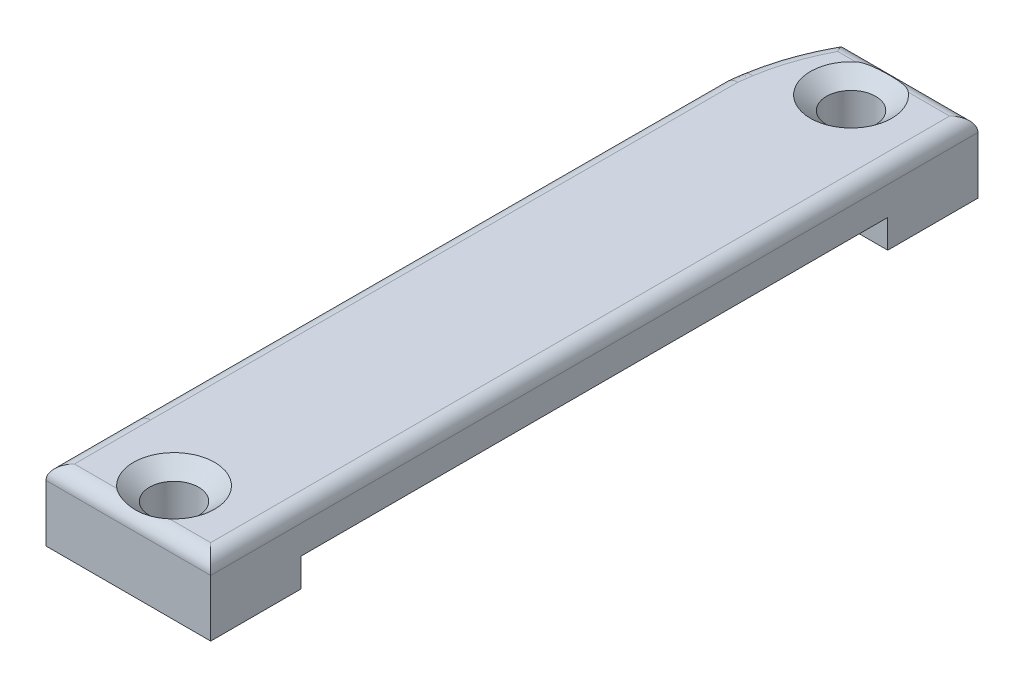
ISO-10303-21;
HEADER;
FILE_DESCRIPTION(('STEP AP214'),'2;1');
FILE_NAME('part.step','',(''),(''),'','','');
FILE_SCHEMA(('AUTOMOTIVE_DESIGN { 1 0 10303 214 1 1 1 1 }'));
ENDSEC;
DATA;
#1=APPLICATION_CONTEXT('core data for automotive mechanical design processes');
#2=APPLICATION_PROTOCOL_DEFINITION('international standard','automotive_design',2000,#1);
#3=PRODUCT_CONTEXT('',#1,'mechanical');
#4=PRODUCT('Part','Part','',(#3));
#5=PRODUCT_RELATED_PRODUCT_CATEGORY('part','',(#4));
#6=PRODUCT_DEFINITION_FORMATION('','',#4);
#7=PRODUCT_DEFINITION_CONTEXT('part definition',#1,'design');
#8=PRODUCT_DEFINITION('design','',#6,#7);
#9=PRODUCT_DEFINITION_SHAPE('','',#8);
#10=(LENGTH_UNIT() NAMED_UNIT(*) SI_UNIT(.MILLI.,.METRE.));
#11=(NAMED_UNIT(*) PLANE_ANGLE_UNIT() SI_UNIT($,.RADIAN.));
#12=(NAMED_UNIT(*) SI_UNIT($,.STERADIAN.) SOLID_ANGLE_UNIT());
#13=UNCERTAINTY_MEASURE_WITH_UNIT(LENGTH_MEASURE(1.E-05),#10,'distance_accuracy_value','');
#14=(GEOMETRIC_REPRESENTATION_CONTEXT(3) GLOBAL_UNCERTAINTY_ASSIGNED_CONTEXT((#13)) GLOBAL_UNIT_ASSIGNED_CONTEXT((#10,
#11,#12)) REPRESENTATION_CONTEXT('',''));
#15=CARTESIAN_POINT('',(0.,0.,0.));
#16=DIRECTION('',(0.,0.,1.));
#17=DIRECTION('',(1.,0.,0.));
#18=AXIS2_PLACEMENT_3D('',#15,#16,#17);
#19=CARTESIAN_POINT('',(-16.6687499998692,27.2895725541895,-228.6));
#20=DIRECTION('',(0.,1.,0.));
#21=DIRECTION('',(0.,0.,1.));
#22=AXIS2_PLACEMENT_3D('',#19,#20,#21);
#23=PLANE('',#22);
#24=DIRECTION('',(1.,0.,0.));
#25=VECTOR('',#24,1.);
#26=CARTESIAN_POINT('',(0.,27.2895725541895,-188.912499999872));
#27=LINE('',#26,#25);
#28=CARTESIAN_POINT('',(-32.5411605445574,27.2895725541895,-188.912499999872));
#29=VERTEX_POINT('',#28);
#30=CARTESIAN_POINT('',(-20.955,27.2895725541895,-188.912499999872));
#31=VERTEX_POINT('',#30);
#32=EDGE_CURVE('E563',#29,#31,#27,.T.);
#33=ORIENTED_EDGE('',*,*,#32,.F.);
#34=DIRECTION('',(0.00189043078895237,0.,-0.99999821313412));
#35=VECTOR('',#34,1.);
#36=CARTESIAN_POINT('',(-32.5411605445571,27.2895725541895,-188.9125));
#37=LINE('',#36,#35);
#38=CARTESIAN_POINT('',(-32.4631755639373,27.2895725541895,-230.187499999999));
#39=VERTEX_POINT('',#38);
#40=EDGE_CURVE('E280',#39,#29,#37,.F.);
#41=ORIENTED_EDGE('',*,*,#40,.F.);
#42=DIRECTION('',(1.,0.,0.));
#43=VECTOR('',#42,1.);
#44=CARTESIAN_POINT('',(0.,27.2895725541895,-230.187499999999));
#45=LINE('',#44,#43);
#46=CARTESIAN_POINT('',(-20.955,27.2895725541895,-230.187499999999));
#47=VERTEX_POINT('',#46);
#48=EDGE_CURVE('E552',#39,#47,#45,.T.);
#49=ORIENTED_EDGE('',*,*,#48,.T.);
#50=DIRECTION('',(0.,0.,-1.));
#51=VECTOR('',#50,1.);
#52=CARTESIAN_POINT('',(-20.955,27.2895725541895,0.));
#53=LINE('',#52,#51);
#54=EDGE_CURVE('E294',#31,#47,#53,.T.);
#55=ORIENTED_EDGE('',*,*,#54,.F.);
#56=EDGE_LOOP('',(#33,#41,#49,#55));
#57=FACE_BOUND('',#56,.T.);
#58=ADVANCED_FACE('F143',(#57),#23,.F.);
#59=CARTESIAN_POINT('',(-32.5411605445571,30.2895725541895,-188.9125));
#60=DIRECTION('',(0.99999821313412,0.,0.00189043078895237));
#61=DIRECTION('',(0.00189043078895237,0.,-0.99999821313412));
#62=AXIS2_PLACEMENT_3D('',#59,#60,#61);
#63=PLANE('',#62);
#64=DIRECTION('',(0.,-1.,0.));
#65=VECTOR('',#64,1.);
#66=CARTESIAN_POINT('',(-32.5411605445571,30.2895725541895,-188.9125));
#67=LINE('',#66,#65);
#68=CARTESIAN_POINT('',(-32.5411605445571,29.2895725541895,-188.9125));
#69=VERTEX_POINT('',#68);
#70=EDGE_CURVE('E285',#69,#29,#67,.T.);
#71=ORIENTED_EDGE('',*,*,#70,.F.);
#72=DIRECTION('',(-0.00189043078895237,0.,0.99999821313412));
#73=VECTOR('',#72,1.);
#74=CARTESIAN_POINT('',(-32.4631328743181,29.2895725541895,-230.1875));
#75=LINE('',#74,#73);
#76=CARTESIAN_POINT('',(-32.4631328743181,29.2895725541895,-230.1875));
#77=VERTEX_POINT('',#76);
#78=EDGE_CURVE('E313',#69,#77,#75,.F.);
#79=ORIENTED_EDGE('',*,*,#78,.T.);
#80=DIRECTION('',(0.,-1.,0.));
#81=VECTOR('',#80,1.);
#82=CARTESIAN_POINT('',(-32.4631328743181,30.2895725541895,-230.1875));
#83=LINE('',#82,#81);
#84=EDGE_CURVE('E275',#77,#39,#83,.T.);
#85=ORIENTED_EDGE('',*,*,#84,.T.);
#86=ORIENTED_EDGE('',*,*,#40,.T.);
#87=EDGE_LOOP('',(#71,#79,#85,#86));
#88=FACE_BOUND('',#87,.T.);
#89=ADVANCED_FACE('F394',(#88),#63,.F.);
#90=CARTESIAN_POINT('',(-16.6687499998692,30.2895725541895,-228.6));
#91=DIRECTION('',(0.,1.,0.));
#92=DIRECTION('',(0.,0.,1.));
#93=AXIS2_PLACEMENT_3D('',#90,#91,#92);
#94=PLANE('',#93);
#95=CARTESIAN_POINT('',(-26.7090664371591,30.2895725541895,-233.3625));
#96=DIRECTION('',(0.,1.,0.));
#97=DIRECTION('',(0.,0.,1.));
#98=AXIS2_PLACEMENT_3D('',#95,#96,#97);
#99=CIRCLE('',#98,2.8575);
#100=CARTESIAN_POINT('',(-28.5623557426912,30.2895725541895,-235.5375));
#101=VERTEX_POINT('',#100);
#102=CARTESIAN_POINT('',(-24.8557771316269,30.2895725541895,-235.5375));
#103=VERTEX_POINT('',#102);
#104=EDGE_CURVE('E157',#101,#103,#99,.T.);
#105=ORIENTED_EDGE('',*,*,#104,.F.);
#106=DIRECTION('',(-1.,0.,0.));
#107=VECTOR('',#106,1.);
#108=CARTESIAN_POINT('',(-30.4169032849471,30.2895725541895,-235.5375));
#109=LINE('',#108,#107);
#110=CARTESIAN_POINT('',(-29.8268926784542,30.2895725541895,-235.5375));
#111=VERTEX_POINT('',#110);
#112=EDGE_CURVE('E258',#101,#111,#109,.T.);
#113=ORIENTED_EDGE('',*,*,#112,.T.);
#114=CARTESIAN_POINT('',(-16.6687499998692,30.2895725541895,-228.6));
#115=DIRECTION('',(0.,1.,0.));
#116=DIRECTION('',(0.,0.,1.));
#117=AXIS2_PLACEMENT_3D('',#114,#115,#116);
#118=CIRCLE('',#117,14.875);
#119=CARTESIAN_POINT('',(-31.3385056177366,30.2895725541895,-231.062497738485));
#120=VERTEX_POINT('',#119);
#121=EDGE_CURVE('E271',#111,#120,#118,.T.);
#122=ORIENTED_EDGE('',*,*,#121,.T.);
#123=CARTESIAN_POINT('',(-32.2668595926922,29.2895725541895,-231.572660262045));
#124=CARTESIAN_POINT('',(-32.2668595926923,30.2895725541895,-231.572660262045));
#125=CARTESIAN_POINT('',(-31.2806575343482,30.2895725541895,-231.407114195592));
#126=CARTESIAN_POINT('',(-32.2861422939527,29.2895725541895,-231.45778806918));
#127=CARTESIAN_POINT('',(-32.2861422939527,30.2895725541895,-231.45778806918));
#128=CARTESIAN_POINT('',(-31.299940228811,30.2895725541895,-231.292242043223));
#129=CARTESIAN_POINT('',(-32.3054249952132,29.2895725541895,-231.342915876316));
#130=CARTESIAN_POINT('',(-32.3054249952132,30.2895725541895,-231.342915876316));
#131=CARTESIAN_POINT('',(-31.3192229232738,30.2895725541895,-231.177369890854));
#132=CARTESIAN_POINT('',(-32.3247076964736,29.2895725541895,-231.228043683452));
#133=CARTESIAN_POINT('',(-32.3247076964736,30.2895725541895,-231.228043683452));
#134=CARTESIAN_POINT('',(-31.3385056177366,30.2895725541895,-231.062497738485));
#135=CARTESIAN_POINT('',(-32.3412204192832,29.2895725541895,-231.129676635952));
#136=CARTESIAN_POINT('',(-32.3412204193037,30.2895725541895,-231.129676635954));
#137=CARTESIAN_POINT('',(-31.3539333108575,30.2895725541895,-230.970593850806));
#138=CARTESIAN_POINT('',(-32.356759160968,29.2895725541895,-231.031181589199));
#139=CARTESIAN_POINT('',(-32.3567591609782,30.2895725541895,-231.0311815892));
#140=CARTESIAN_POINT('',(-31.3684564550032,30.2895725541895,-230.878538797367));
#141=CARTESIAN_POINT('',(-32.385908669484,29.2895725541895,-230.833983945711));
#142=CARTESIAN_POINT('',(-32.3859086694737,30.2895725541895,-230.83398394571));
#143=CARTESIAN_POINT('',(-31.3957105711079,30.2895725541895,-230.694163804468));
#144=CARTESIAN_POINT('',(-32.3995194384385,29.2895725541895,-230.735281349203));
#145=CARTESIAN_POINT('',(-32.399519438418,30.2895725541895,-230.735281349201));
#146=CARTESIAN_POINT('',(-31.4084415450406,30.2895725541895,-230.6018438653));
#147=CARTESIAN_POINT('',(-32.4248330099859,29.2895725541895,-230.537716956382));
#148=CARTESIAN_POINT('',(-32.4248330100064,30.2895725541895,-230.537716956384));
#149=CARTESIAN_POINT('',(-31.432128266178,30.2895725541895,-230.416976454769));
#150=CARTESIAN_POINT('',(-32.4365358148683,29.2895725541895,-230.43885516026));
#151=CARTESIAN_POINT('',(-32.4365358149401,30.2895725541895,-230.438855160267));
#152=CARTESIAN_POINT('',(-31.443084015513,30.2895725541895,-230.324428983678));
#153=CARTESIAN_POINT('',(-32.4528233983303,29.2895725541895,-230.289138811229));
#154=CARTESIAN_POINT('',(-32.4528233982934,30.2895725541895,-230.289138811226));
#155=CARTESIAN_POINT('',(-31.4583383148289,30.2895725541895,-230.184210568212));
#156=CARTESIAN_POINT('',(-32.4581014663056,29.2895725541895,-230.238325130966));
#157=CARTESIAN_POINT('',(-32.4581014661993,30.2895725541895,-230.238325130956));
#158=CARTESIAN_POINT('',(-31.4632827632334,30.2895725541895,-230.136609253723));
#159=CARTESIAN_POINT('',(-32.4631328663774,29.2895725541895,-230.187500080207));
#160=CARTESIAN_POINT('',(-32.4631328661485,30.2895725541895,-230.187500080184));
#161=CARTESIAN_POINT('',(-31.4679972482009,30.2895725541895,-230.088985604637));
#162=CARTESIAN_POINT('',(-32.467598482102,29.2895725541895,-230.142391008155));
#163=CARTESIAN_POINT('',(-32.4675984819494,30.2895725541895,-230.14239100814));
#164=CARTESIAN_POINT('',(-31.4724628616026,30.2895725541895,-230.04387655683));
#165=CARTESIAN_POINT('',(-32.4720640978266,29.2895725541895,-230.097281936104));
#166=CARTESIAN_POINT('',(-32.4720640977503,30.2895725541895,-230.097281936096));
#167=CARTESIAN_POINT('',(-31.4769284750042,30.2895725541895,-229.998767509022));
#168=CARTESIAN_POINT('',(-32.4765297135512,29.2895725541895,-230.052172864052));
#169=CARTESIAN_POINT('',(-32.4765297135512,30.2895725541895,-230.052172864052));
#170=CARTESIAN_POINT('',(-31.4813940884059,30.2895725541895,-229.953658461214));
#171=(BOUNDED_SURFACE() B_SPLINE_SURFACE(3,2,((#123,#124,#125),(#126,#127,#128),(#129,#130,
#131),(#132,#133,#134),(#135,#136,#137),(#138,#139,#140),(#141,#142,#143),(#144,#145,#146),
(#147,#148,#149),(#150,#151,#152),(#153,#154,#155),(#156,#157,#158),(#159,#160,#161),(#162,#163,
#164),(#165,#166,#167),(#168,#169,#170)),.UNSPECIFIED.,.F.,.F.,
.F.) B_SPLINE_SURFACE_WITH_KNOTS((4,3,2,2,2,3,4),(3,3),(0.,0.349437981994646,0.629001779066892,
0.908565268239331,1.18812842191423,1.33169823534988,1.46768687853265),(0.,1.),
.UNSPECIFIED.) GEOMETRIC_REPRESENTATION_ITEM() RATIONAL_B_SPLINE_SURFACE(((1.,0.707106781186548,
1.),(1.,0.707106781186548,1.),(1.,0.707106781186548,1.),(1.,0.707106781186548,1.),(1.,
0.707106781186548,1.),(1.,0.707106781186548,1.),(1.,0.707106781186548,1.),(1.,0.707106781186548,
1.),(1.,0.707106781186548,1.),(1.,0.707106781186548,1.),(1.,0.707106781186548,1.),(1.,
0.707106781186548,1.),(1.,0.707106781186548,1.),(1.,0.707106781186548,1.),(1.,0.707106781186548,
1.),(1.,0.707106781186548,1.))) REPRESENTATION_ITEM('') SURFACE());
#172=CARTESIAN_POINT('',(-31.2806575343482,30.2895725541895,-231.407114195592));
#173=CARTESIAN_POINT('',(-31.299940228811,30.2895725541895,-231.292242043223));
#174=CARTESIAN_POINT('',(-31.3192229232738,30.2895725541895,-231.177369890854));
#175=CARTESIAN_POINT('',(-31.3385056177366,30.2895725541895,-231.062497738485));
#176=CARTESIAN_POINT('',(-31.3539333108575,30.2895725541895,-230.970593850806));
#177=CARTESIAN_POINT('',(-31.3684564550032,30.2895725541895,-230.878538797367));
#178=CARTESIAN_POINT('',(-31.3957105711079,30.2895725541895,-230.694163804468));
#179=CARTESIAN_POINT('',(-31.4084415450406,30.2895725541895,-230.6018438653));
#180=CARTESIAN_POINT('',(-31.432128266178,30.2895725541895,-230.416976454769));
#181=CARTESIAN_POINT('',(-31.443084015513,30.2895725541895,-230.324428983678));
#182=CARTESIAN_POINT('',(-31.4583383148289,30.2895725541895,-230.184210568212));
#183=CARTESIAN_POINT('',(-31.4632827632334,30.2895725541895,-230.136609253723));
#184=CARTESIAN_POINT('',(-31.4679972482009,30.2895725541895,-230.088985604637));
#185=CARTESIAN_POINT('',(-31.4724628616026,30.2895725541895,-230.04387655683));
#186=CARTESIAN_POINT('',(-31.4769284750042,30.2895725541895,-229.998767509022));
#187=CARTESIAN_POINT('',(-31.4813940884059,30.2895725541895,-229.953658461214));
#188=B_SPLINE_CURVE_WITH_KNOTS('',3,(#172,#173,#174,#175,#176,#177,#178,#179,#180,#181,#182,
#183,#184,#185,#186,#187),.UNSPECIFIED.,.F.,.F.,(4,3,2,2,2,3,4),(0.,0.349437981994646,
0.629001779066892,0.908565268239331,1.18812842191423,1.33169823534988,1.46768687853265),.UNSPECIFIED.);
#189=CARTESIAN_POINT('',(-31.4632277082478,30.2895725541895,-230.136389625221));
#190=VERTEX_POINT('',#189);
#191=EDGE_CURVE('E413',#120,#190,#188,.T.);
#192=ORIENTED_EDGE('',*,*,#191,.T.);
#193=DIRECTION('',(-0.00189043078895237,0.,0.99999821313412));
#194=VECTOR('',#193,1.);
#195=CARTESIAN_POINT('',(-31.541162331423,30.2895725541895,-188.910609569211));
#196=LINE('',#195,#194);
#197=CARTESIAN_POINT('',(-31.5411605445571,30.2895725541895,-188.910609569211));
#198=VERTEX_POINT('',#197);
#199=EDGE_CURVE('E490',#190,#198,#196,.T.);
#200=ORIENTED_EDGE('',*,*,#199,.T.);
#201=DIRECTION('',(0.,0.,1.));
#202=VECTOR('',#201,1.);
#203=CARTESIAN_POINT('',(-31.5411605445571,30.2895725541895,-188.9125));
#204=LINE('',#203,#202);
#205=CARTESIAN_POINT('',(-31.5411605445571,30.2895725541895,-183.5625));
#206=VERTEX_POINT('',#205);
#207=EDGE_CURVE('E489',#198,#206,#204,.T.);
#208=ORIENTED_EDGE('',*,*,#207,.T.);
#209=DIRECTION('',(1.,0.,0.));
#210=VECTOR('',#209,1.);
#211=CARTESIAN_POINT('',(-20.955,30.2895725541895,-183.5625));
#212=LINE('',#211,#210);
#213=CARTESIAN_POINT('',(-28.5623557426913,30.2895725541895,-183.5625));
#214=VERTEX_POINT('',#213);
#215=EDGE_CURVE('E420',#206,#214,#212,.T.);
#216=ORIENTED_EDGE('',*,*,#215,.T.);
#217=CARTESIAN_POINT('',(-26.7090664371591,30.2895725541895,-185.7375));
#218=DIRECTION('',(0.,1.,0.));
#219=DIRECTION('',(0.,0.,1.));
#220=AXIS2_PLACEMENT_3D('',#217,#218,#219);
#221=CIRCLE('',#220,2.8575);
#222=CARTESIAN_POINT('',(-24.8557771316269,30.2895725541895,-183.5625));
#223=VERTEX_POINT('',#222);
#224=EDGE_CURVE('E164',#223,#214,#221,.T.);
#225=ORIENTED_EDGE('',*,*,#224,.F.);
#226=CARTESIAN_POINT('',(-21.955,30.2895725541895,-183.5625));
#227=VERTEX_POINT('',#226);
#228=EDGE_CURVE('E491',#223,#227,#212,.T.);
#229=ORIENTED_EDGE('',*,*,#228,.T.);
#230=DIRECTION('',(0.,0.,-1.));
#231=VECTOR('',#230,1.);
#232=CARTESIAN_POINT('',(-21.955,30.2895725541895,-236.5375));
#233=LINE('',#232,#231);
#234=CARTESIAN_POINT('',(-21.955,30.2895725541895,-235.5375));
#235=VERTEX_POINT('',#234);
#236=EDGE_CURVE('E268',#227,#235,#233,.T.);
#237=ORIENTED_EDGE('',*,*,#236,.T.);
#238=EDGE_CURVE('E260',#235,#103,#109,.T.);
#239=ORIENTED_EDGE('',*,*,#238,.T.);
#240=EDGE_LOOP('',(#105,#113,#122,#192,#200,#208,#216,#225,#229,#237,#239));
#241=FACE_BOUND('',#240,.T.);
#242=ADVANCED_FACE('F257',(#241),#94,.T.);
#243=CARTESIAN_POINT('',(-20.955,30.2895725541895,-236.5375));
#244=DIRECTION('',(0.,0.,1.));
#245=DIRECTION('',(1.,0.,0.));
#246=AXIS2_PLACEMENT_3D('',#243,#244,#245);
#247=PLANE('',#246);
#248=DIRECTION('',(0.,-1.,0.));
#249=VECTOR('',#248,1.);
#250=CARTESIAN_POINT('',(-30.4169032849471,30.2895725541895,-236.5375));
#251=LINE('',#250,#249);
#252=CARTESIAN_POINT('',(-30.4169032849471,29.2895725541895,-236.5375));
#253=VERTEX_POINT('',#252);
#254=CARTESIAN_POINT('',(-30.4169032849471,25.2895725541895,-236.5375));
#255=VERTEX_POINT('',#254);
#256=EDGE_CURVE('E291',#253,#255,#251,.T.);
#257=ORIENTED_EDGE('',*,*,#256,.F.);
#258=DIRECTION('',(-1.,0.,0.));
#259=VECTOR('',#258,1.);
#260=CARTESIAN_POINT('',(-20.955,29.2895725541895,-236.5375));
#261=LINE('',#260,#259);
#262=CARTESIAN_POINT('',(-20.955,29.2895725541895,-236.5375));
#263=VERTEX_POINT('',#262);
#264=EDGE_CURVE('E309',#253,#263,#261,.F.);
#265=ORIENTED_EDGE('',*,*,#264,.T.);
#266=DIRECTION('',(0.,-1.,0.));
#267=VECTOR('',#266,1.);
#268=CARTESIAN_POINT('',(-20.955,37.1505780996903,-236.5375));
#269=LINE('',#268,#267);
#270=CARTESIAN_POINT('',(-20.955,25.2895725541895,-236.5375));
#271=VERTEX_POINT('',#270);
#272=EDGE_CURVE('E304',#263,#271,#269,.T.);
#273=ORIENTED_EDGE('',*,*,#272,.T.);
#274=DIRECTION('',(1.,0.,0.));
#275=VECTOR('',#274,1.);
#276=CARTESIAN_POINT('',(6.93859815458737E-13,25.2895725541895,-236.5375));
#277=LINE('',#276,#275);
#278=EDGE_CURVE('E508',#255,#271,#277,.T.);
#279=ORIENTED_EDGE('',*,*,#278,.F.);
#280=EDGE_LOOP('',(#257,#265,#273,#279));
#281=FACE_BOUND('',#280,.T.);
#282=ADVANCED_FACE('F404',(#281),#247,.F.);
#283=CARTESIAN_POINT('',(-16.6687499998692,2.1886596322844,-228.6));
#284=DIRECTION('',(0.,-1.,0.));
#285=DIRECTION('',(0.,0.,-1.));
#286=AXIS2_PLACEMENT_3D('',#283,#284,#285);
#287=CYLINDRICAL_SURFACE('',#286,15.875);
#288=DIRECTION('',(0.,-1.,0.));
#289=VECTOR('',#288,1.);
#290=CARTESIAN_POINT('',(-32.3247076760807,30.2895725541895,-231.228043804938));
#291=LINE('',#290,#289);
#292=CARTESIAN_POINT('',(-32.3247076760807,29.2895725541895,-231.228043804938));
#293=VERTEX_POINT('',#292);
#294=CARTESIAN_POINT('',(-32.3247074389691,25.2895725541895,-231.228045217475));
#295=VERTEX_POINT('',#294);
#296=EDGE_CURVE('E279',#293,#295,#291,.T.);
#297=ORIENTED_EDGE('',*,*,#296,.F.);
#298=CARTESIAN_POINT('',(-16.6687499998692,29.2895725541895,-228.6));
#299=DIRECTION('',(0.,1.,0.));
#300=DIRECTION('',(0.,0.,1.));
#301=AXIS2_PLACEMENT_3D('',#298,#299,#300);
#302=CIRCLE('',#301,15.875);
#303=EDGE_CURVE('E307',#293,#253,#302,.F.);
#304=ORIENTED_EDGE('',*,*,#303,.T.);
#305=ORIENTED_EDGE('',*,*,#256,.T.);
#306=CARTESIAN_POINT('',(-16.6687499998692,25.2895725541895,-228.6));
#307=DIRECTION('',(0.,-1.,0.));
#308=DIRECTION('',(0.,0.,-1.));
#309=AXIS2_PLACEMENT_3D('',#306,#307,#308);
#310=CIRCLE('',#309,15.875);
#311=EDGE_CURVE('E512',#295,#255,#310,.T.);
#312=ORIENTED_EDGE('',*,*,#311,.F.);
#313=EDGE_LOOP('',(#297,#304,#305,#312));
#314=FACE_BOUND('',#313,.T.);
#315=ADVANCED_FACE('F423',(#314),#287,.T.);
#316=CARTESIAN_POINT('',(-32.5411605445571,30.2895725541895,-182.5625));
#317=DIRECTION('',(0.,0.,-1.));
#318=DIRECTION('',(-1.,0.,0.));
#319=AXIS2_PLACEMENT_3D('',#316,#317,#318);
#320=PLANE('',#319);
#321=DIRECTION('',(0.,-1.,0.));
#322=VECTOR('',#321,1.);
#323=CARTESIAN_POINT('',(-20.955,30.2895725541895,-182.5625));
#324=LINE('',#323,#322);
#325=CARTESIAN_POINT('',(-20.955,29.2895725541895,-182.5625));
#326=VERTEX_POINT('',#325);
#327=CARTESIAN_POINT('',(-20.955,25.2895725541895,-182.5625));
#328=VERTEX_POINT('',#327);
#329=EDGE_CURVE('E292',#326,#328,#324,.T.);
#330=ORIENTED_EDGE('',*,*,#329,.F.);
#331=DIRECTION('',(1.,0.,0.));
#332=VECTOR('',#331,1.);
#333=CARTESIAN_POINT('',(-32.5411605445571,29.2895725541895,-182.5625));
#334=LINE('',#333,#332);
#335=CARTESIAN_POINT('',(-32.5411605445571,29.2895725541895,-182.5625));
#336=VERTEX_POINT('',#335);
#337=EDGE_CURVE('E430',#326,#336,#334,.F.);
#338=ORIENTED_EDGE('',*,*,#337,.T.);
#339=DIRECTION('',(0.,-1.,0.));
#340=VECTOR('',#339,1.);
#341=CARTESIAN_POINT('',(-32.5411605445571,30.2895725541895,-182.5625));
#342=LINE('',#341,#340);
#343=CARTESIAN_POINT('',(-32.5411605445571,25.2895725541895,-182.5625));
#344=VERTEX_POINT('',#343);
#345=EDGE_CURVE('E289',#336,#344,#342,.T.);
#346=ORIENTED_EDGE('',*,*,#345,.T.);
#347=DIRECTION('',(-1.,0.,0.));
#348=VECTOR('',#347,1.);
#349=CARTESIAN_POINT('',(0.,25.2895725541895,-182.5625));
#350=LINE('',#349,#348);
#351=EDGE_CURVE('E457',#328,#344,#350,.T.);
#352=ORIENTED_EDGE('',*,*,#351,.F.);
#353=EDGE_LOOP('',(#330,#338,#346,#352));
#354=FACE_BOUND('',#353,.T.);
#355=ADVANCED_FACE('F443',(#354),#320,.F.);
#356=CARTESIAN_POINT('',(-32.5411605445571,30.2895725541895,-188.9125));
#357=DIRECTION('',(1.,0.,0.));
#358=DIRECTION('',(0.,0.,-1.));
#359=AXIS2_PLACEMENT_3D('',#356,#357,#358);
#360=PLANE('',#359);
#361=ORIENTED_EDGE('',*,*,#345,.F.);
#362=DIRECTION('',(0.,0.,1.));
#363=VECTOR('',#362,1.);
#364=CARTESIAN_POINT('',(-32.5411605445571,29.2895725541895,-230.1875));
#365=LINE('',#364,#363);
#366=EDGE_CURVE('E311',#336,#69,#365,.F.);
#367=ORIENTED_EDGE('',*,*,#366,.T.);
#368=ORIENTED_EDGE('',*,*,#70,.T.);
#369=DIRECTION('',(0.,1.,0.));
#370=VECTOR('',#369,1.);
#371=CARTESIAN_POINT('',(-32.5411605445574,25.2895725541895,-188.912499999872));
#372=LINE('',#371,#370);
#373=CARTESIAN_POINT('',(-32.5411605445574,25.2895725541895,-188.912499999872));
#374=VERTEX_POINT('',#373);
#375=EDGE_CURVE('E556',#374,#29,#372,.T.);
#376=ORIENTED_EDGE('',*,*,#375,.F.);
#377=DIRECTION('',(0.,0.,-1.));
#378=VECTOR('',#377,1.);
#379=CARTESIAN_POINT('',(-32.5411605445571,25.2895725541895,0.));
#380=LINE('',#379,#378);
#381=EDGE_CURVE('E567',#344,#374,#380,.T.);
#382=ORIENTED_EDGE('',*,*,#381,.F.);
#383=EDGE_LOOP('',(#361,#367,#368,#376,#382));
#384=FACE_BOUND('',#383,.T.);
#385=ADVANCED_FACE('F441',(#384),#360,.F.);
#386=CARTESIAN_POINT('',(-20.9549999999999,11.6581936,0.));
#387=DIRECTION('',(-1.,0.,0.));
#388=DIRECTION('',(0.,0.,1.));
#389=AXIS2_PLACEMENT_3D('',#386,#387,#388);
#390=PLANE('',#389);
#391=ORIENTED_EDGE('',*,*,#272,.F.);
#392=DIRECTION('',(0.,0.,-1.));
#393=VECTOR('',#392,1.);
#394=CARTESIAN_POINT('',(-20.955,29.2895725541895,-182.5625));
#395=LINE('',#394,#393);
#396=EDGE_CURVE('E305',#263,#326,#395,.F.);
#397=ORIENTED_EDGE('',*,*,#396,.T.);
#398=ORIENTED_EDGE('',*,*,#329,.T.);
#399=DIRECTION('',(0.,0.,1.));
#400=VECTOR('',#399,1.);
#401=CARTESIAN_POINT('',(-20.955,25.2895725541895,0.));
#402=LINE('',#401,#400);
#403=CARTESIAN_POINT('',(-20.955,25.2895725541895,-188.912499999872));
#404=VERTEX_POINT('',#403);
#405=EDGE_CURVE('E724',#404,#328,#402,.T.);
#406=ORIENTED_EDGE('',*,*,#405,.F.);
#407=DIRECTION('',(0.,1.,0.));
#408=VECTOR('',#407,1.);
#409=CARTESIAN_POINT('',(-20.955,25.2895725541895,-188.912499999872));
#410=LINE('',#409,#408);
#411=EDGE_CURVE('E726',#404,#31,#410,.T.);
#412=ORIENTED_EDGE('',*,*,#411,.T.);
#413=ORIENTED_EDGE('',*,*,#54,.T.);
#414=DIRECTION('',(0.,1.,0.));
#415=VECTOR('',#414,1.);
#416=CARTESIAN_POINT('',(-20.955,25.2895725541895,-230.187499999999));
#417=LINE('',#416,#415);
#418=CARTESIAN_POINT('',(-20.955,25.2895725541895,-230.187499999999));
#419=VERTEX_POINT('',#418);
#420=EDGE_CURVE('E500',#419,#47,#417,.T.);
#421=ORIENTED_EDGE('',*,*,#420,.F.);
#422=DIRECTION('',(0.,0.,1.));
#423=VECTOR('',#422,1.);
#424=CARTESIAN_POINT('',(-20.955,25.2895725541895,0.));
#425=LINE('',#424,#423);
#426=EDGE_CURVE('E478',#271,#419,#425,.T.);
#427=ORIENTED_EDGE('',*,*,#426,.F.);
#428=EDGE_LOOP('',(#391,#397,#398,#406,#412,#413,#421,#427));
#429=FACE_BOUND('',#428,.T.);
#430=ADVANCED_FACE('F409',(#429),#390,.F.);
#431=CARTESIAN_POINT('',(-21.955,29.2895725541895,-228.6));
#432=DIRECTION('',(0.,0.,1.));
#433=DIRECTION('',(1.,0.,0.));
#434=AXIS2_PLACEMENT_3D('',#431,#432,#433);
#435=CYLINDRICAL_SURFACE('',#434,1.);
#436=CARTESIAN_POINT('',(-21.955,29.2895725541895,-235.5375));
#437=DIRECTION('',(0.707106781186547,0.,0.707106781186548));
#438=DIRECTION('',(0.707106781186548,0.,-0.707106781186547));
#439=AXIS2_PLACEMENT_3D('',#436,#437,#438);
#440=ELLIPSE('',#439,1.41421356237309,1.);
#441=EDGE_CURVE('E469',#235,#263,#440,.F.);
#442=ORIENTED_EDGE('',*,*,#441,.F.);
#443=ORIENTED_EDGE('',*,*,#236,.F.);
#444=CARTESIAN_POINT('',(-21.955,29.2895725541895,-183.5625));
#445=DIRECTION('',(-0.707106781186547,0.,0.707106781186548));
#446=DIRECTION('',(0.707106781186548,0.,0.707106781186547));
#447=AXIS2_PLACEMENT_3D('',#444,#445,#446);
#448=ELLIPSE('',#447,1.4142135623731,1.);
#449=EDGE_CURVE('E465',#326,#227,#448,.T.);
#450=ORIENTED_EDGE('',*,*,#449,.F.);
#451=ORIENTED_EDGE('',*,*,#396,.F.);
#452=EDGE_LOOP('',(#442,#443,#450,#451));
#453=FACE_BOUND('',#452,.T.);
#454=ADVANCED_FACE('F145',(#453),#435,.T.);
#455=CARTESIAN_POINT('',(-16.6687499998692,29.2895725541895,-183.5625));
#456=DIRECTION('',(-1.,0.,0.));
#457=DIRECTION('',(0.,0.,1.));
#458=AXIS2_PLACEMENT_3D('',#455,#456,#457);
#459=CYLINDRICAL_SURFACE('',#458,1.);
#460=CARTESIAN_POINT('',(-28.6356661851649,30.2872271023674,-183.63095));
#461=CARTESIAN_POINT('',(-28.6205286473145,30.2882917491652,-183.61538522521));
#462=CARTESIAN_POINT('',(-28.604874629757,30.2889630693424,-183.600319709309));
#463=CARTESIAN_POINT('',(-28.5727116755363,30.2896421284577,-183.571149090201));
#464=CARTESIAN_POINT('',(-28.5562037195781,30.2896506124122,-183.557042926524));
#465=CARTESIAN_POINT('',(-28.5057787834322,30.2888706307665,-183.516190570769));
#466=CARTESIAN_POINT('',(-28.4708083686473,30.2872847607079,-183.490758255112));
#467=CARTESIAN_POINT('',(-28.3994667102205,30.2827297791538,-183.443351561115));
#468=CARTESIAN_POINT('',(-28.3631234796852,30.2797812639762,-183.421331998533));
#469=CARTESIAN_POINT('',(-28.2890028766513,30.2729827937519,-183.379896108177));
#470=CARTESIAN_POINT('',(-28.251223360133,30.2691314428748,-183.360483885334));
#471=CARTESIAN_POINT('',(-28.147536067687,30.2579800030022,-183.311076193914));
#472=CARTESIAN_POINT('',(-28.0806262342889,30.2501667949216,-183.283301929792));
#473=CARTESIAN_POINT('',(-27.9448242355828,30.234216513883,-183.233366413082));
#474=CARTESIAN_POINT('',(-27.8759317819907,30.2260793937598,-183.211205981415));
#475=CARTESIAN_POINT('',(-27.7360204827668,30.210213534169,-183.171498914357));
#476=CARTESIAN_POINT('',(-27.6649870768011,30.2024898377887,-183.154001918693));
#477=CARTESIAN_POINT('',(-27.5218732792377,30.1881470044779,-183.123355645875));
#478=CARTESIAN_POINT('',(-27.449792618013,30.1815281576838,-183.110207509857));
#479=CARTESIAN_POINT('',(-27.2687575189011,30.1669372242091,-183.082295382682));
#480=CARTESIAN_POINT('',(-27.1593369786297,30.1599358357815,-183.069994302678));
#481=CARTESIAN_POINT('',(-26.9396643104916,30.1503938467758,-183.053506836401));
#482=CARTESIAN_POINT('',(-26.8294118462982,30.1478551594287,-183.049323930438));
#483=CARTESIAN_POINT('',(-26.6093644309709,30.1475683573144,-183.048841899464));
#484=CARTESIAN_POINT('',(-26.4995696099509,30.1497991327109,-183.052508034377));
#485=CARTESIAN_POINT('',(-26.2807893552932,30.1587163826199,-183.067863676485));
#486=CARTESIAN_POINT('',(-26.1718035346545,30.1654005664207,-183.079549058889));
#487=CARTESIAN_POINT('',(-25.9447416131577,30.1831867863695,-183.113206425686));
#488=CARTESIAN_POINT('',(-25.8268208766611,30.1946574535011,-183.136073952529));
#489=CARTESIAN_POINT('',(-25.6523324785975,30.2135270320452,-183.179679315152));
#490=CARTESIAN_POINT('',(-25.5945026110071,30.2201027732872,-183.195789284229));
#491=CARTESIAN_POINT('',(-25.4799663541865,30.2333961354596,-183.231501727485));
#492=CARTESIAN_POINT('',(-25.4232596653792,30.2401137175427,-183.251103256058));
#493=CARTESIAN_POINT('',(-25.2882982041598,30.2558936953715,-183.303164498091));
#494=CARTESIAN_POINT('',(-25.210745796489,30.2647876452199,-183.337600446337));
#495=CARTESIAN_POINT('',(-25.0983272686643,30.2759125747645,-183.396599904669));
#496=CARTESIAN_POINT('',(-25.061601859846,30.2792453958166,-183.417423338281));
#497=CARTESIAN_POINT('',(-24.989815699246,30.2847506924066,-183.46188053758));
#498=CARTESIAN_POINT('',(-24.9547534609655,30.2869242225968,-183.485511724923));
#499=CARTESIAN_POINT('',(-24.8963658150263,30.2891766066356,-183.528958813315));
#500=CARTESIAN_POINT('',(-24.8724897467861,30.2896700781892,-183.548006134625));
#501=CARTESIAN_POINT('',(-24.8262254119055,30.2894446539064,-183.588014361283));
#502=CARTESIAN_POINT('',(-24.8038443521196,30.2887202722349,-183.60898352095));
#503=CARTESIAN_POINT('',(-24.7824666891531,30.2872271023673,-183.63095));
#504=B_SPLINE_CURVE_WITH_KNOTS('',3,(#460,#461,#462,#463,#464,#465,#466,#467,#468,#469,#470,
#471,#472,#473,#474,#475,#476,#477,#478,#479,#480,#481,#482,#483,#484,#485,#486,#487,#488,#489,
#490,#491,#492,#493,#494,#495,#496,#497,#498,#499,#500,#501,#502,#503),.UNSPECIFIED.,.F.,.F.,(4,
2,2,2,2,2,2,2,2,2,2,2,2,2,2,2,2,2,2,2,2,4),(0.,0.0651723079122,0.13027136223275,
0.259827222251057,0.387485862118481,0.515343185865299,0.733598510708031,0.951885733060401,
1.17241126448489,1.39299461569248,1.72355937016046,2.05426580846286,2.38351155757327,
2.71258808226469,3.07390101482848,3.25497912570657,3.4360082702901,3.69129333792242,
3.81823901093938,3.94506899867346,4.03660060599484,4.12854562421349),.UNSPECIFIED.);
#505=EDGE_CURVE('E152',#214,#223,#504,.T.);
#506=ORIENTED_EDGE('',*,*,#505,.F.);
#507=ORIENTED_EDGE('',*,*,#215,.F.);
#508=CARTESIAN_POINT('',(-31.5411605445571,29.2895725541895,-183.5625));
#509=DIRECTION('',(-0.707106781186547,0.,-0.707106781186547));
#510=DIRECTION('',(-0.707106781186547,0.,0.707106781186547));
#511=AXIS2_PLACEMENT_3D('',#508,#509,#510);
#512=ELLIPSE('',#511,1.41421356237309,1.);
#513=EDGE_CURVE('E473',#336,#206,#512,.T.);
#514=ORIENTED_EDGE('',*,*,#513,.F.);
#515=ORIENTED_EDGE('',*,*,#337,.F.);
#516=ORIENTED_EDGE('',*,*,#449,.T.);
#517=ORIENTED_EDGE('',*,*,#228,.F.);
#518=EDGE_LOOP('',(#506,#507,#514,#515,#516,#517));
#519=FACE_BOUND('',#518,.T.);
#520=ADVANCED_FACE('F347',(#519),#459,.T.);
#521=CARTESIAN_POINT('',(-16.6687499998691,29.2895725541895,-235.5375));
#522=DIRECTION('',(1.,0.,0.));
#523=DIRECTION('',(0.,0.,-1.));
#524=AXIS2_PLACEMENT_3D('',#521,#522,#523);
#525=CYLINDRICAL_SURFACE('',#524,1.);
#526=CARTESIAN_POINT('',(-24.7219118864962,30.280098829158,-235.400176664048));
#527=CARTESIAN_POINT('',(-24.7418754682052,30.283582828233,-235.425454078737));
#528=CARTESIAN_POINT('',(-24.763334936133,30.2859630622456,-235.44958427713));
#529=CARTESIAN_POINT('',(-24.8084979565588,30.2889630150972,-235.495576417424));
#530=CARTESIAN_POINT('',(-24.8321913036119,30.2895903740521,-235.517447801475));
#531=CARTESIAN_POINT('',(-24.8808763270653,30.2895543662755,-235.558840702345));
#532=CARTESIAN_POINT('',(-24.905841902869,30.288911032478,-235.578393620406));
#533=CARTESIAN_POINT('',(-24.9570563753837,30.2866826029916,-235.615741936705));
#534=CARTESIAN_POINT('',(-24.9833069765462,30.2850962235881,-235.633534900637));
#535=CARTESIAN_POINT('',(-25.055796604627,30.2798602741448,-235.679591414926));
#536=CARTESIAN_POINT('',(-25.1029734870422,30.2755457646635,-235.706301683648));
#537=CARTESIAN_POINT('',(-25.1992397557874,30.2657960648461,-235.75571773598));
#538=CARTESIAN_POINT('',(-25.2483297386059,30.2603605226772,-235.778422258236));
#539=CARTESIAN_POINT('',(-25.348417349322,30.2489124152777,-235.820606949616));
#540=CARTESIAN_POINT('',(-25.3994296450804,30.2428943642378,-235.840050549063));
#541=CARTESIAN_POINT('',(-25.5025218718996,30.2307792996655,-235.875856270918));
#542=CARTESIAN_POINT('',(-25.5546021843863,30.2246822582196,-235.892217270396));
#543=CARTESIAN_POINT('',(-25.7045839543388,30.2076496792696,-235.935045720024));
#544=CARTESIAN_POINT('',(-25.803492113565,30.1970470261081,-235.95815325441));
#545=CARTESIAN_POINT('',(-26.0031025858084,30.1783412590176,-235.996341168649));
#546=CARTESIAN_POINT('',(-26.1038060776181,30.1702398565003,-236.011416057483));
#547=CARTESIAN_POINT('',(-26.3060558939977,30.157528340598,-236.034314230701));
#548=CARTESIAN_POINT('',(-26.4076002431489,30.152911593391,-236.04215130029));
#549=CARTESIAN_POINT('',(-26.6110475626057,30.1476651841659,-236.051020104169));
#550=CARTESIAN_POINT('',(-26.7129503907549,30.1470340883871,-236.052054285671));
#551=CARTESIAN_POINT('',(-26.9203149083693,30.1498769808785,-236.047289499154));
#552=CARTESIAN_POINT('',(-27.0257688139729,30.1535036761303,-236.041236363865));
#553=CARTESIAN_POINT('',(-27.2358325591439,30.1646903890771,-236.021543331732));
#554=CARTESIAN_POINT('',(-27.3404418051527,30.1722529633468,-236.007898503259));
#555=CARTESIAN_POINT('',(-27.5479314725819,30.1903488248802,-235.972243624173));
#556=CARTESIAN_POINT('',(-27.6508125860449,30.2008808914139,-235.950237009722));
#557=CARTESIAN_POINT('',(-27.853772676337,30.2233738761464,-235.896495005698));
#558=CARTESIAN_POINT('',(-27.9538555114258,30.23533269368,-235.864773813986));
#559=CARTESIAN_POINT('',(-28.1232424146897,30.2551119128806,-235.799338134253));
#560=CARTESIAN_POINT('',(-28.1935966913523,30.2631814710266,-235.768444615881));
#561=CARTESIAN_POINT('',(-28.3300757050786,30.2771056621056,-235.698884021591));
#562=CARTESIAN_POINT('',(-28.3962283752411,30.2829765646418,-235.660277424216));
#563=CARTESIAN_POINT('',(-28.5029708200903,30.2888448908552,-235.586255546011));
#564=CARTESIAN_POINT('',(-28.5452301875074,30.2900833836107,-235.553421280325));
#565=CARTESIAN_POINT('',(-28.6050339345563,30.2890201268631,-235.499690139211));
#566=CARTESIAN_POINT('',(-28.6244825216982,30.2881639567237,-235.480899532768));
#567=CARTESIAN_POINT('',(-28.6617198816584,30.2851689166705,-235.44173532019));
#568=CARTESIAN_POINT('',(-28.6795034630698,30.2830261798138,-235.421357103625));
#569=CARTESIAN_POINT('',(-28.6962209878219,30.2800988291582,-235.400176664048));
#570=B_SPLINE_CURVE_WITH_KNOTS('',3,(#526,#527,#528,#529,#530,#531,#532,#533,#534,#535,#536,
#537,#538,#539,#540,#541,#542,#543,#544,#545,#546,#547,#548,#549,#550,#551,#552,#553,#554,#555,
#556,#557,#558,#559,#560,#561,#562,#563,#564,#565,#566,#567,#568,#569),.UNSPECIFIED.,.F.,.F.,(4,
2,2,2,2,2,2,2,2,2,2,2,2,2,2,2,2,2,2,2,2,4),(0.,0.0969885025553611,0.19355360467585,
0.288608470958862,0.383793027296171,0.546674025216181,0.709606220866274,0.874258480958735,
1.03897060506941,1.34488531088476,1.65100886888205,1.95654817193284,2.26197755688894,
2.57870451138203,2.89563745507539,3.21244030013875,3.52878232960674,3.76020452283802,
3.98987871529975,4.14992127511326,4.2309762635928,4.31227610147503),.UNSPECIFIED.);
#571=EDGE_CURVE('E13',#103,#101,#570,.T.);
#572=ORIENTED_EDGE('',*,*,#571,.F.);
#573=ORIENTED_EDGE('',*,*,#238,.F.);
#574=ORIENTED_EDGE('',*,*,#441,.T.);
#575=ORIENTED_EDGE('',*,*,#264,.F.);
#576=CARTESIAN_POINT('',(-30.4169032849471,29.2895725541895,-236.5375));
#577=CARTESIAN_POINT('',(-30.4169040496663,29.3149883465545,-236.537501518655));
#578=CARTESIAN_POINT('',(-30.4163434487215,29.3403908677017,-236.536530315895));
#579=CARTESIAN_POINT('',(-30.4141128271705,29.3909923255567,-236.532667158175));
#580=CARTESIAN_POINT('',(-30.4124431641667,29.4161913252373,-236.529775822337));
#581=CARTESIAN_POINT('',(-30.4058123104073,29.4909904846016,-236.518296321033));
#582=CARTESIAN_POINT('',(-30.3992289429562,29.5400519136374,-236.506902090679));
#583=CARTESIAN_POINT('',(-30.3820460365197,29.6351963487812,-236.477197441179));
#584=CARTESIAN_POINT('',(-30.3714497897963,29.6812817603029,-236.458892691626));
#585=CARTESIAN_POINT('',(-30.3466796970391,29.7695133187403,-236.416170177137));
#586=CARTESIAN_POINT('',(-30.3325029936885,29.8116562824744,-236.391747530054));
#587=CARTESIAN_POINT('',(-30.3002952000711,29.8931948047159,-236.336368311163));
#588=CARTESIAN_POINT('',(-30.2821061223043,29.9323456002928,-236.305144907726));
#589=CARTESIAN_POINT('',(-30.2429490449277,30.0048505594655,-236.238084414624));
#590=CARTESIAN_POINT('',(-30.2219803669211,30.0382033033651,-236.202246198715));
#591=CARTESIAN_POINT('',(-30.1750209384891,30.1026512666768,-236.122194065208));
#592=CARTESIAN_POINT('',(-30.1487305353398,30.1329237388835,-236.077494340034));
#593=CARTESIAN_POINT('',(-30.0940397280028,30.1855441745353,-235.984803075879));
#594=CARTESIAN_POINT('',(-30.065637059958,30.2078834830165,-235.936808009413));
#595=CARTESIAN_POINT('',(-30.0034267127156,30.247062396636,-235.832038018863));
#596=CARTESIAN_POINT('',(-29.9694088067442,30.2627432589402,-235.774955864609));
#597=CARTESIAN_POINT('',(-29.9004020416273,30.2838120068265,-235.659623472794));
#598=CARTESIAN_POINT('',(-29.8654153327903,30.2892210826576,-235.601375891027));
#599=CARTESIAN_POINT('',(-29.8292081429251,30.2895670367451,-235.541338639954));
#600=CARTESIAN_POINT('',(-29.8280504367496,30.2895725624261,-235.539419235249));
#601=CARTESIAN_POINT('',(-29.8268926784542,30.2895725541895,-235.5375));
#602=B_SPLINE_CURVE_WITH_KNOTS('',3,(#576,#577,#578,#579,#580,#581,#582,#583,#584,#585,#586,
#587,#588,#589,#590,#591,#592,#593,#594,#595,#596,#597,#598,#599,#600,#601),.UNSPECIFIED.,.F.,
.F.,(4,2,2,2,2,2,2,2,2,2,2,2,4),(0.,0.076196819229652,0.152369081722822,0.303946922109036,
0.455400672877312,0.606975672521713,0.766173657090134,0.925410567737615,1.10484228005185,
1.2844691526177,1.48848795116625,1.69208540863059,1.69880994749287),.UNSPECIFIED.);
#603=EDGE_CURVE('E266',#111,#253,#602,.F.);
#604=ORIENTED_EDGE('',*,*,#603,.F.);
#605=ORIENTED_EDGE('',*,*,#112,.F.);
#606=EDGE_LOOP('',(#572,#573,#574,#575,#604,#605));
#607=FACE_BOUND('',#606,.T.);
#608=ADVANCED_FACE('F263',(#607),#525,.T.);
#609=CARTESIAN_POINT('',(-31.5411605445571,29.2895725541895,-228.6));
#610=DIRECTION('',(0.,0.,-1.));
#611=DIRECTION('',(-1.,0.,0.));
#612=AXIS2_PLACEMENT_3D('',#609,#610,#611);
#613=CYLINDRICAL_SURFACE('',#612,1.);
#614=ORIENTED_EDGE('',*,*,#513,.T.);
#615=ORIENTED_EDGE('',*,*,#207,.F.);
#616=CARTESIAN_POINT('',(-31.5411605445571,29.2895725541895,-188.9125));
#617=DIRECTION('',(0.,0.00189042741103024,-0.999998213140505));
#618=DIRECTION('',(0.,0.999998213140505,0.00189042741103024));
#619=AXIS2_PLACEMENT_3D('',#616,#617,#618);
#620=CIRCLE('',#619,1.);
#621=EDGE_CURVE('E498',#69,#198,#620,.T.);
#622=ORIENTED_EDGE('',*,*,#621,.F.);
#623=ORIENTED_EDGE('',*,*,#366,.F.);
#624=EDGE_LOOP('',(#614,#615,#622,#623));
#625=FACE_BOUND('',#624,.T.);
#626=ADVANCED_FACE('F346',(#625),#613,.T.);
#627=CARTESIAN_POINT('',(-16.6687499998692,29.2895725541895,-228.6));
#628=DIRECTION('',(0.,1.,0.));
#629=DIRECTION('',(0.,0.,1.));
#630=AXIS2_PLACEMENT_3D('',#627,#628,#629);
#631=TOROIDAL_SURFACE('',#630,14.875,1.);
#632=ORIENTED_EDGE('',*,*,#603,.T.);
#633=ORIENTED_EDGE('',*,*,#303,.F.);
#634=CARTESIAN_POINT('',(-31.3385056177367,29.2895725541895,-231.062497738485));
#635=DIRECTION('',(-0.165546066452776,0.,0.986202058344036));
#636=DIRECTION('',(0.986202058344036,0.,0.165546066452776));
#637=AXIS2_PLACEMENT_3D('',#634,#635,#636);
#638=CIRCLE('',#637,1.);
#639=EDGE_CURVE('E322',#120,#293,#638,.T.);
#640=ORIENTED_EDGE('',*,*,#639,.F.);
#641=ORIENTED_EDGE('',*,*,#121,.F.);
#642=EDGE_LOOP('',(#632,#633,#640,#641));
#643=FACE_BOUND('',#642,.T.);
#644=ADVANCED_FACE('F340',(#643),#631,.T.);
#645=CARTESIAN_POINT('',(-31.4660792698617,29.2895725541895,-228.627973376831));
#646=DIRECTION('',(0.00189043078895237,0.,-0.99999821313412));
#647=DIRECTION('',(-0.99999821313412,0.,-0.00189043078895237));
#648=AXIS2_PLACEMENT_3D('',#645,#646,#647);
#649=CYLINDRICAL_SURFACE('',#648,1.);
#650=ORIENTED_EDGE('',*,*,#621,.T.);
#651=ORIENTED_EDGE('',*,*,#199,.F.);
#652=CARTESIAN_POINT('',(-32.4631328743181,29.2895725541895,-230.1875));
#653=CARTESIAN_POINT('',(-32.4631327042234,29.3176821715056,-230.187499975411));
#654=CARTESIAN_POINT('',(-32.4619470138196,29.3457783133774,-230.187440319454));
#655=CARTESIAN_POINT('',(-32.4572169285551,29.4017693835333,-230.187202263503));
#656=CARTESIAN_POINT('',(-32.4536726518978,29.4296643218302,-230.18702386946));
#657=CARTESIAN_POINT('',(-32.4395354844658,29.5127008112257,-230.186312115366));
#658=CARTESIAN_POINT('',(-32.4254381642721,29.5672858280493,-230.185602179331));
#659=CARTESIAN_POINT('',(-32.388292511877,29.6733090837269,-230.183729658149));
#660=CARTESIAN_POINT('',(-32.3652400055406,29.7247458421735,-230.182566861917));
#661=CARTESIAN_POINT('',(-32.3108458523219,29.8230124369055,-230.179818983979));
#662=CARTESIAN_POINT('',(-32.2795061161453,29.8698433317097,-230.178233999612));
#663=CARTESIAN_POINT('',(-32.2094129374818,29.9575976856681,-230.174682939328));
#664=CARTESIAN_POINT('',(-32.1706561370356,29.9985184543246,-230.172716690795));
#665=CARTESIAN_POINT('',(-32.0868231870473,30.0732878672048,-230.16845418843));
#666=CARTESIAN_POINT('',(-32.041744824973,30.1071340249564,-230.166157819049));
#667=CARTESIAN_POINT('',(-31.9465001979527,30.1668229834975,-230.161294816815));
#668=CARTESIAN_POINT('',(-31.8963268466322,30.1926544289146,-230.158727807346));
#669=CARTESIAN_POINT('',(-31.7923870182548,30.2355041327187,-230.153395534871));
#670=CARTESIAN_POINT('',(-31.7386239336141,30.2525305826563,-230.15063045887));
#671=CARTESIAN_POINT('',(-31.6509170213083,30.2723805130702,-230.146108189374));
#672=CARTESIAN_POINT('',(-31.6176084958006,30.2781599160921,-230.144388225328));
#673=CARTESIAN_POINT('',(-31.5506106849385,30.2863161584424,-230.140922447235));
#674=CARTESIAN_POINT('',(-31.5169220331903,30.2886980005765,-230.139176675028));
#675=CARTESIAN_POINT('',(-31.4765548915798,30.2895060723193,-230.137081617463));
#676=CARTESIAN_POINT('',(-31.4698908225559,30.2895727320451,-230.136735647384));
#677=CARTESIAN_POINT('',(-31.4632277082495,30.2895725541895,-230.136389625221));
#678=B_SPLINE_CURVE_WITH_KNOTS('',3,(#652,#653,#654,#655,#656,#657,#658,#659,#660,#661,#662,
#663,#664,#665,#666,#667,#668,#669,#670,#671,#672,#673,#674,#675,#676,#677),.UNSPECIFIED.,.F.,
.F.,(4,2,2,2,2,2,2,2,2,2,2,2,4),(0.,0.0842770274706507,0.168549831613292,0.336823572992523,
0.505175843357879,0.673489332175023,0.841879203327694,1.0103281583373,1.1790146960427,
1.34754401600487,1.44894678143761,1.55020007969266,1.57021866483647),.UNSPECIFIED.);
#679=EDGE_CURVE('E315',#77,#190,#678,.T.);
#680=ORIENTED_EDGE('',*,*,#679,.F.);
#681=ORIENTED_EDGE('',*,*,#78,.F.);
#682=EDGE_LOOP('',(#650,#651,#680,#681));
#683=FACE_BOUND('',#682,.T.);
#684=ADVANCED_FACE('F336',(#683),#649,.T.);
#685=ORIENTED_EDGE('',*,*,#639,.T.);
#686=CARTESIAN_POINT('',(-32.4765297135512,29.2895725541895,-230.052172864052));
#687=CARTESIAN_POINT('',(-32.4720640978266,29.2895725541895,-230.097281936104));
#688=CARTESIAN_POINT('',(-32.467598482102,29.2895725541895,-230.142391008155));
#689=CARTESIAN_POINT('',(-32.4631328663774,29.2895725541895,-230.187500080207));
#690=CARTESIAN_POINT('',(-32.4581014663056,29.2895725541895,-230.238325130966));
#691=CARTESIAN_POINT('',(-32.4528233983303,29.2895725541895,-230.289138811229));
#692=CARTESIAN_POINT('',(-32.4365358148683,29.2895725541895,-230.43885516026));
#693=CARTESIAN_POINT('',(-32.4248330099859,29.2895725541895,-230.537716956382));
#694=CARTESIAN_POINT('',(-32.3995194384386,29.2895725541895,-230.735281349203));
#695=CARTESIAN_POINT('',(-32.385908669484,29.2895725541895,-230.833983945711));
#696=CARTESIAN_POINT('',(-32.356759160968,29.2895725541895,-231.031181589199));
#697=CARTESIAN_POINT('',(-32.3412204192832,29.2895725541895,-231.129676635952));
#698=CARTESIAN_POINT('',(-32.3247076964736,29.2895725541895,-231.228043683452));
#699=CARTESIAN_POINT('',(-32.3054249952132,29.2895725541895,-231.342915876316));
#700=CARTESIAN_POINT('',(-32.2861422939527,29.2895725541895,-231.45778806918));
#701=CARTESIAN_POINT('',(-32.2668595926922,29.2895725541895,-231.572660262045));
#702=B_SPLINE_CURVE_WITH_KNOTS('',3,(#686,#687,#688,#689,#690,#691,#692,#693,#694,#695,#696,
#697,#698,#699,#700,#701),.UNSPECIFIED.,.F.,.F.,(4,3,2,2,2,3,4),(0.,0.135988643182765,
0.279558456618414,0.559121610293317,0.838685099465756,1.118248896538,1.46768687853265),.UNSPECIFIED.);
#703=EDGE_CURVE('E270',#77,#293,#702,.T.);
#704=ORIENTED_EDGE('',*,*,#703,.F.);
#705=ORIENTED_EDGE('',*,*,#679,.T.);
#706=ORIENTED_EDGE('',*,*,#191,.F.);
#707=EDGE_LOOP('',(#685,#704,#705,#706));
#708=FACE_BOUND('',#707,.T.);
#709=ADVANCED_FACE('F331',(#708),#171,.T.);
#710=CARTESIAN_POINT('',(0.,25.2895725541895,-230.187499999999));
#711=DIRECTION('',(0.,0.,1.));
#712=DIRECTION('',(1.,0.,0.));
#713=AXIS2_PLACEMENT_3D('',#710,#711,#712);
#714=PLANE('',#713);
#715=ORIENTED_EDGE('',*,*,#48,.F.);
#716=DIRECTION('',(0.,-1.,0.));
#717=VECTOR('',#716,1.);
#718=CARTESIAN_POINT('',(-32.4631328743176,26.2895725541895,-230.187500000001));
#719=LINE('',#718,#717);
#720=CARTESIAN_POINT('',(-32.4631328743176,25.2895725541895,-230.1875));
#721=VERTEX_POINT('',#720);
#722=EDGE_CURVE('E323',#721,#39,#719,.F.);
#723=ORIENTED_EDGE('',*,*,#722,.F.);
#724=DIRECTION('',(1.,0.,0.));
#725=VECTOR('',#724,1.);
#726=CARTESIAN_POINT('',(0.,25.2895725541895,-230.187499999999));
#727=LINE('',#726,#725);
#728=EDGE_CURVE('E555',#721,#419,#727,.T.);
#729=ORIENTED_EDGE('',*,*,#728,.T.);
#730=ORIENTED_EDGE('',*,*,#420,.T.);
#731=EDGE_LOOP('',(#715,#723,#729,#730));
#732=FACE_BOUND('',#731,.T.);
#733=ADVANCED_FACE('F544',(#732),#714,.T.);
#734=CARTESIAN_POINT('',(-32.3229686342996,30.2895725541895,-231.238403740518));
#735=CARTESIAN_POINT('',(-32.3235483148933,30.2895725541895,-231.234950428658));
#736=CARTESIAN_POINT('',(-32.324127995487,30.2895725541895,-231.231497116798));
#737=CARTESIAN_POINT('',(-32.3247076760807,30.2895725541895,-231.228043804938));
#738=CARTESIAN_POINT('',(-32.3826757354489,30.2895725541895,-230.88271261893));
#739=CARTESIAN_POINT('',(-32.4286483267866,30.2895725541895,-230.535842991242));
#740=CARTESIAN_POINT('',(-32.4631328743176,30.2895725541895,-230.1875));
#741=B_SPLINE_CURVE_WITH_KNOTS('',3,(#734,#735,#736,#737,#738,#739,#740),.UNSPECIFIED.,.F.,.F.,
(4,3,4),(-0.01,0.,1.),.UNSPECIFIED.);
#742=DIRECTION('',(0.,-1.,0.));
#743=VECTOR('',#742,1.);
#744=SURFACE_OF_LINEAR_EXTRUSION('',#741,#743);
#745=ORIENTED_EDGE('',*,*,#722,.T.);
#746=ORIENTED_EDGE('',*,*,#84,.F.);
#747=ORIENTED_EDGE('',*,*,#703,.T.);
#748=ORIENTED_EDGE('',*,*,#296,.T.);
#749=CARTESIAN_POINT('',(-32.3247074389691,25.2895725541895,-231.228045217475));
#750=CARTESIAN_POINT('',(-32.3247075180063,25.2895725541895,-231.228044746629));
#751=CARTESIAN_POINT('',(-32.3247075970435,25.2895725541895,-231.228044275784));
#752=CARTESIAN_POINT('',(-32.3247076760807,25.2895725541895,-231.228043804938));
#753=CARTESIAN_POINT('',(-32.3826757354489,25.2895725541895,-230.88271261893));
#754=CARTESIAN_POINT('',(-32.4286483267866,25.2895725541895,-230.535842991242));
#755=CARTESIAN_POINT('',(-32.4631328743176,25.2895725541895,-230.1875));
#756=B_SPLINE_CURVE_WITH_KNOTS('',3,(#749,#750,#751,#752,#753,#754,#755),.UNSPECIFIED.,.F.,.F.,
(4,3,4),(-1.36346120976389E-06,0.,1.),.UNSPECIFIED.);
#757=EDGE_CURVE('E526',#721,#295,#756,.F.);
#758=ORIENTED_EDGE('',*,*,#757,.F.);
#759=EDGE_LOOP('',(#745,#746,#747,#748,#758));
#760=FACE_BOUND('',#759,.T.);
#761=ADVANCED_FACE('F433',(#760),#744,.F.);
#762=CARTESIAN_POINT('',(0.,25.2895725541895,0.));
#763=DIRECTION('',(0.,-1.,0.));
#764=DIRECTION('',(0.,0.,-1.));
#765=AXIS2_PLACEMENT_3D('',#762,#763,#764);
#766=PLANE('',#765);
#767=CARTESIAN_POINT('',(-26.7090664371591,25.2895725541895,-233.3625));
#768=DIRECTION('',(0.,-1.,0.));
#769=DIRECTION('',(0.,0.,-1.));
#770=AXIS2_PLACEMENT_3D('',#767,#768,#769);
#771=CIRCLE('',#770,1.72719999999999);
#772=CARTESIAN_POINT('',(-26.7090664371591,25.2895725541895,-235.0897));
#773=VERTEX_POINT('',#772);
#774=EDGE_CURVE('E147',#773,#773,#771,.T.);
#775=ORIENTED_EDGE('',*,*,#774,.F.);
#776=EDGE_LOOP('',(#775));
#777=FACE_BOUND('',#776,.T.);
#778=ORIENTED_EDGE('',*,*,#728,.F.);
#779=ORIENTED_EDGE('',*,*,#757,.T.);
#780=ORIENTED_EDGE('',*,*,#311,.T.);
#781=ORIENTED_EDGE('',*,*,#278,.T.);
#782=ORIENTED_EDGE('',*,*,#426,.T.);
#783=EDGE_LOOP('',(#778,#779,#780,#781,#782));
#784=FACE_BOUND('',#783,.T.);
#785=ADVANCED_FACE('F533',(#777,#784),#766,.T.);
#786=CARTESIAN_POINT('',(0.,25.2895725541895,-188.912499999872));
#787=DIRECTION('',(0.,0.,1.));
#788=DIRECTION('',(1.,0.,0.));
#789=AXIS2_PLACEMENT_3D('',#786,#787,#788);
#790=PLANE('',#789);
#791=ORIENTED_EDGE('',*,*,#32,.T.);
#792=ORIENTED_EDGE('',*,*,#411,.F.);
#793=DIRECTION('',(1.,0.,0.));
#794=VECTOR('',#793,1.);
#795=CARTESIAN_POINT('',(0.,25.2895725541895,-188.912499999872));
#796=LINE('',#795,#794);
#797=EDGE_CURVE('E722',#374,#404,#796,.T.);
#798=ORIENTED_EDGE('',*,*,#797,.F.);
#799=ORIENTED_EDGE('',*,*,#375,.T.);
#800=EDGE_LOOP('',(#791,#792,#798,#799));
#801=FACE_BOUND('',#800,.T.);
#802=ADVANCED_FACE('F542',(#801),#790,.F.);
#803=CARTESIAN_POINT('',(0.,25.2895725541895,0.));
#804=DIRECTION('',(0.,-1.,0.));
#805=DIRECTION('',(0.,0.,-1.));
#806=AXIS2_PLACEMENT_3D('',#803,#804,#805);
#807=PLANE('',#806);
#808=CARTESIAN_POINT('',(-26.7090664371591,25.2895725541895,-185.7375));
#809=DIRECTION('',(0.,-1.,0.));
#810=DIRECTION('',(0.,0.,-1.));
#811=AXIS2_PLACEMENT_3D('',#808,#809,#810);
#812=CIRCLE('',#811,1.72719999999999);
#813=CARTESIAN_POINT('',(-26.7090664371591,25.2895725541895,-187.4647));
#814=VERTEX_POINT('',#813);
#815=EDGE_CURVE('E362',#814,#814,#812,.T.);
#816=ORIENTED_EDGE('',*,*,#815,.F.);
#817=EDGE_LOOP('',(#816));
#818=FACE_BOUND('',#817,.T.);
#819=ORIENTED_EDGE('',*,*,#381,.T.);
#820=ORIENTED_EDGE('',*,*,#797,.T.);
#821=ORIENTED_EDGE('',*,*,#405,.T.);
#822=ORIENTED_EDGE('',*,*,#351,.T.);
#823=EDGE_LOOP('',(#819,#820,#821,#822));
#824=FACE_BOUND('',#823,.T.);
#825=ADVANCED_FACE('F646',(#818,#824),#807,.T.);
#826=CARTESIAN_POINT('',(-26.7090664371591,30.2895725541895,-185.7375));
#827=DIRECTION('',(0.,1.,0.));
#828=DIRECTION('',(0.,0.,1.));
#829=AXIS2_PLACEMENT_3D('',#826,#827,#828);
#830=CYLINDRICAL_SURFACE('',#829,1.72719999999999);
#831=ORIENTED_EDGE('',*,*,#815,.T.);
#832=EDGE_LOOP('',(#831));
#833=FACE_BOUND('',#832,.T.);
#834=CARTESIAN_POINT('',(-26.7090664371591,29.3411382410698,-185.7375));
#835=DIRECTION('',(0.,1.,0.));
#836=DIRECTION('',(0.,0.,1.));
#837=AXIS2_PLACEMENT_3D('',#834,#835,#836);
#838=CIRCLE('',#837,1.72719999999999);
#839=CARTESIAN_POINT('',(-26.7090664371591,29.3411382410698,-184.0103));
#840=VERTEX_POINT('',#839);
#841=EDGE_CURVE('E714',#840,#840,#838,.T.);
#842=ORIENTED_EDGE('',*,*,#841,.T.);
#843=EDGE_LOOP('',(#842));
#844=FACE_BOUND('',#843,.T.);
#845=ADVANCED_FACE('F375',(#833,#844),#830,.F.);
#846=CARTESIAN_POINT('',(-26.7090664371591,30.2895725541895,-185.7375));
#847=DIRECTION('',(0.,1.,0.));
#848=DIRECTION('',(0.,0.,1.));
#849=AXIS2_PLACEMENT_3D('',#846,#847,#848);
#850=CONICAL_SURFACE('',#849,2.8575,0.872664625997169);
#851=ORIENTED_EDGE('',*,*,#505,.T.);
#852=ORIENTED_EDGE('',*,*,#224,.T.);
#853=EDGE_LOOP('',(#851,#852));
#854=FACE_BOUND('',#853,.T.);
#855=ORIENTED_EDGE('',*,*,#841,.F.);
#856=EDGE_LOOP('',(#855));
#857=FACE_BOUND('',#856,.T.);
#858=ADVANCED_FACE('F370',(#854,#857),#850,.F.);
#859=CARTESIAN_POINT('',(-26.7090664371591,30.2895725541895,-233.3625));
#860=DIRECTION('',(0.,1.,0.));
#861=DIRECTION('',(0.,0.,1.));
#862=AXIS2_PLACEMENT_3D('',#859,#860,#861);
#863=CYLINDRICAL_SURFACE('',#862,1.72719999999999);
#864=ORIENTED_EDGE('',*,*,#774,.T.);
#865=EDGE_LOOP('',(#864));
#866=FACE_BOUND('',#865,.T.);
#867=CARTESIAN_POINT('',(-26.7090664371591,29.3411382410698,-233.3625));
#868=DIRECTION('',(0.,1.,0.));
#869=DIRECTION('',(0.,0.,1.));
#870=AXIS2_PLACEMENT_3D('',#867,#868,#869);
#871=CIRCLE('',#870,1.72719999999999);
#872=CARTESIAN_POINT('',(-26.7090664371591,29.3411382410698,-231.6353));
#873=VERTEX_POINT('',#872);
#874=EDGE_CURVE('E261',#873,#873,#871,.T.);
#875=ORIENTED_EDGE('',*,*,#874,.T.);
#876=EDGE_LOOP('',(#875));
#877=FACE_BOUND('',#876,.T.);
#878=ADVANCED_FACE('F367',(#866,#877),#863,.F.);
#879=CARTESIAN_POINT('',(-26.7090664371591,30.2895725541895,-233.3625));
#880=DIRECTION('',(0.,1.,0.));
#881=DIRECTION('',(0.,0.,1.));
#882=AXIS2_PLACEMENT_3D('',#879,#880,#881);
#883=CONICAL_SURFACE('',#882,2.8575,0.872664625997169);
#884=ORIENTED_EDGE('',*,*,#571,.T.);
#885=ORIENTED_EDGE('',*,*,#104,.T.);
#886=EDGE_LOOP('',(#884,#885));
#887=FACE_BOUND('',#886,.T.);
#888=ORIENTED_EDGE('',*,*,#874,.F.);
#889=EDGE_LOOP('',(#888));
#890=FACE_BOUND('',#889,.T.);
#891=ADVANCED_FACE('F250',(#887,#890),#883,.F.);
#892=CLOSED_SHELL('',(#58,#89,#242,#282,#315,#355,#385,#430,#454,#520,#608,#626,#644,#684,#709,
#733,#761,#785,#802,#825,#845,#858,#878,#891));
#893=MANIFOLD_SOLID_BREP('B2',#892);
#894=ADVANCED_BREP_SHAPE_REPRESENTATION('',(#18,#893),#14);
#895=SHAPE_DEFINITION_REPRESENTATION(#9,#894);
ENDSEC;
END-ISO-10303-21;
